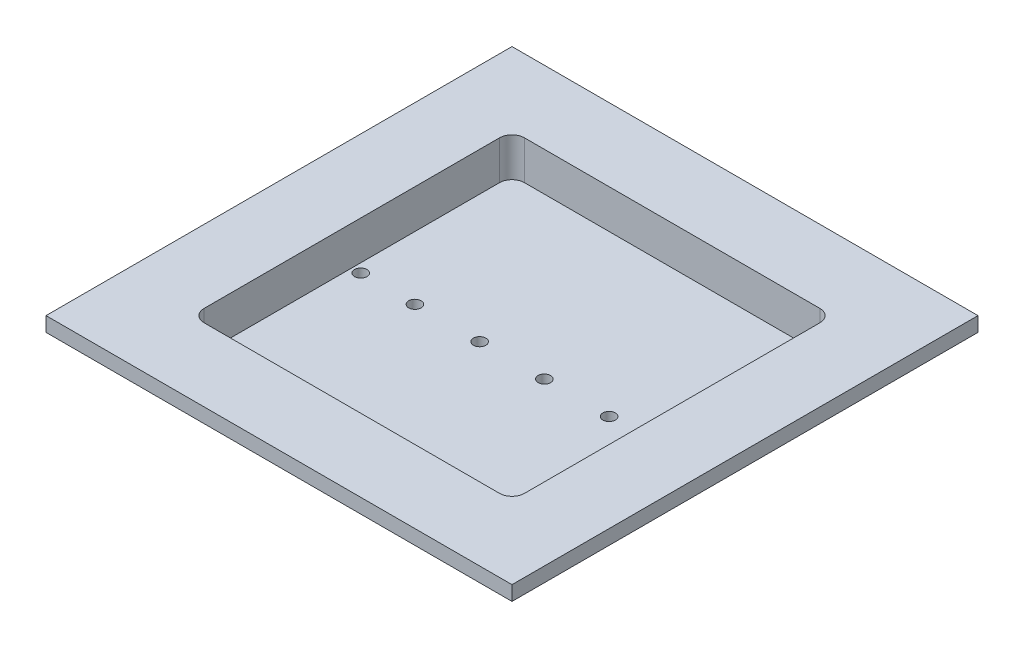
ISO-10303-21;
HEADER;
FILE_DESCRIPTION(('STEP AP214'),'2;1');
FILE_NAME('part.step','',(''),(''),'','','');
FILE_SCHEMA(('AUTOMOTIVE_DESIGN { 1 0 10303 214 1 1 1 1 }'));
ENDSEC;
DATA;
#1=APPLICATION_CONTEXT('core data for automotive mechanical design processes');
#2=APPLICATION_PROTOCOL_DEFINITION('international standard','automotive_design',2000,#1);
#3=PRODUCT_CONTEXT('',#1,'mechanical');
#4=PRODUCT('Part','Part','',(#3));
#5=PRODUCT_RELATED_PRODUCT_CATEGORY('part','',(#4));
#6=PRODUCT_DEFINITION_FORMATION('','',#4);
#7=PRODUCT_DEFINITION_CONTEXT('part definition',#1,'design');
#8=PRODUCT_DEFINITION('design','',#6,#7);
#9=PRODUCT_DEFINITION_SHAPE('','',#8);
#10=(LENGTH_UNIT() NAMED_UNIT(*) SI_UNIT(.MILLI.,.METRE.));
#11=(NAMED_UNIT(*) PLANE_ANGLE_UNIT() SI_UNIT($,.RADIAN.));
#12=(NAMED_UNIT(*) SI_UNIT($,.STERADIAN.) SOLID_ANGLE_UNIT());
#13=UNCERTAINTY_MEASURE_WITH_UNIT(LENGTH_MEASURE(1.E-05),#10,'distance_accuracy_value','');
#14=(GEOMETRIC_REPRESENTATION_CONTEXT(3) GLOBAL_UNCERTAINTY_ASSIGNED_CONTEXT((#13)) GLOBAL_UNIT_ASSIGNED_CONTEXT((#10,
#11,#12)) REPRESENTATION_CONTEXT('',''));
#15=CARTESIAN_POINT('',(0.,0.,0.));
#16=DIRECTION('',(0.,0.,1.));
#17=DIRECTION('',(1.,0.,0.));
#18=AXIS2_PLACEMENT_3D('',#15,#16,#17);
#19=CARTESIAN_POINT('',(0.,-7.5,0.));
#20=DIRECTION('',(0.,-1.,0.));
#21=DIRECTION('',(0.,0.,-1.));
#22=AXIS2_PLACEMENT_3D('',#19,#20,#21);
#23=PLANE('',#22);
#24=CARTESIAN_POINT('',(61.6825,-7.5,-37.4074999999998));
#25=DIRECTION('',(0.,-1.,0.));
#26=DIRECTION('',(0.,0.,-1.));
#27=AXIS2_PLACEMENT_3D('',#24,#25,#26);
#28=CIRCLE('',#27,0.999999999999992);
#29=CARTESIAN_POINT('',(61.6825,-7.5,-38.4074999999998));
#30=VERTEX_POINT('',#29);
#31=EDGE_CURVE('E487',#30,#30,#28,.F.);
#32=ORIENTED_EDGE('',*,*,#31,.T.);
#33=EDGE_LOOP('',(#32));
#34=FACE_BOUND('',#33,.T.);
#35=DIRECTION('',(0.,0.,1.));
#36=VECTOR('',#35,1.);
#37=CARTESIAN_POINT('',(65.2,-7.5,0.));
#38=LINE('',#37,#36);
#39=CARTESIAN_POINT('',(65.2,-7.5,-65.2));
#40=VERTEX_POINT('',#39);
#41=CARTESIAN_POINT('',(65.2,-7.5,-9.59999999999999));
#42=VERTEX_POINT('',#41);
#43=EDGE_CURVE('E353',#40,#42,#38,.T.);
#44=ORIENTED_EDGE('',*,*,#43,.T.);
#45=DIRECTION('',(-1.,0.,0.));
#46=VECTOR('',#45,1.);
#47=CARTESIAN_POINT('',(0.,-7.5,-9.59999999999998));
#48=LINE('',#47,#46);
#49=CARTESIAN_POINT('',(9.59999999999998,-7.5,-9.59999999999998));
#50=VERTEX_POINT('',#49);
#51=EDGE_CURVE('E356',#42,#50,#48,.T.);
#52=ORIENTED_EDGE('',*,*,#51,.T.);
#53=DIRECTION('',(0.,0.,-1.));
#54=VECTOR('',#53,1.);
#55=CARTESIAN_POINT('',(9.59999999999999,-7.5,0.));
#56=LINE('',#55,#54);
#57=CARTESIAN_POINT('',(9.59999999999998,-7.5,-65.2));
#58=VERTEX_POINT('',#57);
#59=EDGE_CURVE('E347',#50,#58,#56,.T.);
#60=ORIENTED_EDGE('',*,*,#59,.T.);
#61=DIRECTION('',(1.,0.,0.));
#62=VECTOR('',#61,1.);
#63=CARTESIAN_POINT('',(0.,-7.5,-65.2));
#64=LINE('',#63,#62);
#65=EDGE_CURVE('E350',#58,#40,#64,.T.);
#66=ORIENTED_EDGE('',*,*,#65,.T.);
#67=EDGE_LOOP('',(#44,#52,#60,#66));
#68=FACE_BOUND('',#67,.T.);
#69=CARTESIAN_POINT('',(52.9824999883334,-7.5,-37.4025));
#70=DIRECTION('',(0.,-1.,0.));
#71=DIRECTION('',(0.,0.,-1.));
#72=AXIS2_PLACEMENT_3D('',#69,#70,#71);
#73=CIRCLE('',#72,0.999999999999998);
#74=CARTESIAN_POINT('',(52.9824999883334,-7.5,-38.4025));
#75=VERTEX_POINT('',#74);
#76=EDGE_CURVE('E461',#75,#75,#73,.T.);
#77=ORIENTED_EDGE('',*,*,#76,.F.);
#78=EDGE_LOOP('',(#77));
#79=FACE_BOUND('',#78,.T.);
#80=CARTESIAN_POINT('',(42.5886111061111,-7.5,-37.4075));
#81=DIRECTION('',(0.,-1.,0.));
#82=DIRECTION('',(0.,0.,-1.));
#83=AXIS2_PLACEMENT_3D('',#80,#81,#82);
#84=CIRCLE('',#83,0.999999999999998);
#85=CARTESIAN_POINT('',(42.5886111061111,-7.5,-38.4075));
#86=VERTEX_POINT('',#85);
#87=EDGE_CURVE('E465',#86,#86,#84,.T.);
#88=ORIENTED_EDGE('',*,*,#87,.F.);
#89=EDGE_LOOP('',(#88));
#90=FACE_BOUND('',#89,.T.);
#91=CARTESIAN_POINT('',(32.1986111061111,-7.5,-37.4074999999999));
#92=DIRECTION('',(0.,-1.,0.));
#93=DIRECTION('',(0.,0.,-1.));
#94=AXIS2_PLACEMENT_3D('',#91,#92,#93);
#95=CIRCLE('',#94,0.999999999999998);
#96=CARTESIAN_POINT('',(32.1986111061111,-7.5,-38.4074999999999));
#97=VERTEX_POINT('',#96);
#98=EDGE_CURVE('E469',#97,#97,#95,.T.);
#99=ORIENTED_EDGE('',*,*,#98,.F.);
#100=EDGE_LOOP('',(#99));
#101=FACE_BOUND('',#100,.T.);
#102=CARTESIAN_POINT('',(21.8086111061111,-7.5,-37.4074999999999));
#103=DIRECTION('',(0.,-1.,0.));
#104=DIRECTION('',(0.,0.,-1.));
#105=AXIS2_PLACEMENT_3D('',#102,#103,#104);
#106=CIRCLE('',#105,0.999999999999998);
#107=CARTESIAN_POINT('',(21.8086111061111,-7.5,-38.4074999999999));
#108=VERTEX_POINT('',#107);
#109=EDGE_CURVE('E473',#108,#108,#106,.T.);
#110=ORIENTED_EDGE('',*,*,#109,.F.);
#111=EDGE_LOOP('',(#110));
#112=FACE_BOUND('',#111,.T.);
#113=CARTESIAN_POINT('',(13.1125,-7.5,-37.4074999999998));
#114=DIRECTION('',(0.,-1.,0.));
#115=DIRECTION('',(0.,0.,-1.));
#116=AXIS2_PLACEMENT_3D('',#113,#114,#115);
#117=CIRCLE('',#116,1.);
#118=CARTESIAN_POINT('',(13.1125,-7.5,-38.4074999999998));
#119=VERTEX_POINT('',#118);
#120=EDGE_CURVE('E215',#119,#119,#117,.T.);
#121=ORIENTED_EDGE('',*,*,#120,.F.);
#122=EDGE_LOOP('',(#121));
#123=FACE_BOUND('',#122,.T.);
#124=ADVANCED_FACE('F40',(#34,#68,#79,#90,#101,#112,#123),#23,.T.);
#125=CARTESIAN_POINT('',(61.1125,-3.89583333333333,-13.6875));
#126=DIRECTION('',(0.,-1.,0.));
#127=DIRECTION('',(0.,0.,-1.));
#128=AXIS2_PLACEMENT_3D('',#125,#126,#127);
#129=PLANE('',#128);
#130=CARTESIAN_POINT('',(21.8086111061111,-3.89583333333333,-37.4074999999999));
#131=DIRECTION('',(0.,1.,0.));
#132=DIRECTION('',(0.,0.,1.));
#133=AXIS2_PLACEMENT_3D('',#130,#131,#132);
#134=CIRCLE('',#133,0.999999999999998);
#135=CARTESIAN_POINT('',(21.8086111061111,-3.89583333333333,-36.4074999999999));
#136=VERTEX_POINT('',#135);
#137=EDGE_CURVE('E508',#136,#136,#134,.T.);
#138=ORIENTED_EDGE('',*,*,#137,.F.);
#139=EDGE_LOOP('',(#138));
#140=FACE_BOUND('',#139,.T.);
#141=CARTESIAN_POINT('',(42.5886111061111,-3.89583333333333,-37.4075));
#142=DIRECTION('',(0.,1.,0.));
#143=DIRECTION('',(0.,0.,1.));
#144=AXIS2_PLACEMENT_3D('',#141,#142,#143);
#145=CIRCLE('',#144,0.999999999999998);
#146=CARTESIAN_POINT('',(42.5886111061111,-3.89583333333333,-36.4075));
#147=VERTEX_POINT('',#146);
#148=EDGE_CURVE('E500',#147,#147,#145,.T.);
#149=ORIENTED_EDGE('',*,*,#148,.F.);
#150=EDGE_LOOP('',(#149));
#151=FACE_BOUND('',#150,.T.);
#152=CARTESIAN_POINT('',(61.1125,-3.89583333333333,-13.6875));
#153=DIRECTION('',(0.,1.,0.));
#154=DIRECTION('',(0.,0.,-1.));
#155=AXIS2_PLACEMENT_3D('',#152,#153,#154);
#156=CIRCLE('',#155,2.);
#157=CARTESIAN_POINT('',(61.1125,-3.89583333333333,-11.6875));
#158=VERTEX_POINT('',#157);
#159=CARTESIAN_POINT('',(63.1125,-3.89583333333333,-13.6875));
#160=VERTEX_POINT('',#159);
#161=EDGE_CURVE('E185',#158,#160,#156,.T.);
#162=ORIENTED_EDGE('',*,*,#161,.T.);
#163=DIRECTION('',(0.,0.,-1.));
#164=VECTOR('',#163,1.);
#165=CARTESIAN_POINT('',(63.1125,-3.89583333333333,-61.1125));
#166=LINE('',#165,#164);
#167=CARTESIAN_POINT('',(63.1125,-3.89583333333333,-61.1125));
#168=VERTEX_POINT('',#167);
#169=EDGE_CURVE('E195',#160,#168,#166,.T.);
#170=ORIENTED_EDGE('',*,*,#169,.T.);
#171=CARTESIAN_POINT('',(61.1125,-3.89583333333333,-61.1125));
#172=DIRECTION('',(0.,1.,0.));
#173=DIRECTION('',(0.,0.,1.));
#174=AXIS2_PLACEMENT_3D('',#171,#172,#173);
#175=CIRCLE('',#174,2.);
#176=CARTESIAN_POINT('',(61.1125,-3.89583333333333,-63.1125));
#177=VERTEX_POINT('',#176);
#178=EDGE_CURVE('E201',#168,#177,#175,.T.);
#179=ORIENTED_EDGE('',*,*,#178,.T.);
#180=DIRECTION('',(-1.,0.,0.));
#181=VECTOR('',#180,1.);
#182=CARTESIAN_POINT('',(61.1125,-3.89583333333333,-63.1125));
#183=LINE('',#182,#181);
#184=CARTESIAN_POINT('',(13.6875,-3.89583333333333,-63.1125));
#185=VERTEX_POINT('',#184);
#186=EDGE_CURVE('E220',#177,#185,#183,.T.);
#187=ORIENTED_EDGE('',*,*,#186,.T.);
#188=CARTESIAN_POINT('',(13.6875,-3.89583333333333,-61.1125));
#189=DIRECTION('',(0.,1.,0.));
#190=DIRECTION('',(0.,0.,-1.));
#191=AXIS2_PLACEMENT_3D('',#188,#189,#190);
#192=CIRCLE('',#191,2.);
#193=CARTESIAN_POINT('',(11.6875,-3.89583333333333,-61.1125));
#194=VERTEX_POINT('',#193);
#195=EDGE_CURVE('E224',#185,#194,#192,.T.);
#196=ORIENTED_EDGE('',*,*,#195,.T.);
#197=DIRECTION('',(0.,0.,1.));
#198=VECTOR('',#197,1.);
#199=CARTESIAN_POINT('',(11.6875,-3.89583333333333,-61.1125));
#200=LINE('',#199,#198);
#201=CARTESIAN_POINT('',(11.6875,-3.89583333333333,-13.6875));
#202=VERTEX_POINT('',#201);
#203=EDGE_CURVE('E228',#194,#202,#200,.T.);
#204=ORIENTED_EDGE('',*,*,#203,.T.);
#205=CARTESIAN_POINT('',(13.6875,-3.89583333333333,-13.6875));
#206=DIRECTION('',(0.,1.,0.));
#207=DIRECTION('',(0.,0.,1.));
#208=AXIS2_PLACEMENT_3D('',#205,#206,#207);
#209=CIRCLE('',#208,2.);
#210=CARTESIAN_POINT('',(13.6875,-3.89583333333333,-11.6875));
#211=VERTEX_POINT('',#210);
#212=EDGE_CURVE('E232',#202,#211,#209,.T.);
#213=ORIENTED_EDGE('',*,*,#212,.T.);
#214=DIRECTION('',(1.,0.,0.));
#215=VECTOR('',#214,1.);
#216=CARTESIAN_POINT('',(61.1125,-3.89583333333333,-11.6875));
#217=LINE('',#216,#215);
#218=EDGE_CURVE('E192',#211,#158,#217,.T.);
#219=ORIENTED_EDGE('',*,*,#218,.T.);
#220=EDGE_LOOP('',(#162,#170,#179,#187,#196,#204,#213,#219));
#221=FACE_BOUND('',#220,.T.);
#222=CARTESIAN_POINT('',(61.6825,-3.89583333333333,-37.4074999999998));
#223=DIRECTION('',(0.,1.,0.));
#224=DIRECTION('',(0.,0.,1.));
#225=AXIS2_PLACEMENT_3D('',#222,#223,#224);
#226=CIRCLE('',#225,0.999999999999992);
#227=CARTESIAN_POINT('',(61.6825,-3.89583333333333,-36.4074999999999));
#228=VERTEX_POINT('',#227);
#229=EDGE_CURVE('E492',#228,#228,#226,.F.);
#230=ORIENTED_EDGE('',*,*,#229,.T.);
#231=EDGE_LOOP('',(#230));
#232=FACE_BOUND('',#231,.T.);
#233=CARTESIAN_POINT('',(52.9824999883334,-3.89583333333333,-37.4025));
#234=DIRECTION('',(0.,1.,0.));
#235=DIRECTION('',(0.,0.,1.));
#236=AXIS2_PLACEMENT_3D('',#233,#234,#235);
#237=CIRCLE('',#236,0.999999999999998);
#238=CARTESIAN_POINT('',(52.9824999883334,-3.89583333333333,-36.4025));
#239=VERTEX_POINT('',#238);
#240=EDGE_CURVE('E496',#239,#239,#237,.T.);
#241=ORIENTED_EDGE('',*,*,#240,.F.);
#242=EDGE_LOOP('',(#241));
#243=FACE_BOUND('',#242,.T.);
#244=CARTESIAN_POINT('',(32.1986111061111,-3.89583333333333,-37.4074999999999));
#245=DIRECTION('',(0.,1.,0.));
#246=DIRECTION('',(0.,0.,1.));
#247=AXIS2_PLACEMENT_3D('',#244,#245,#246);
#248=CIRCLE('',#247,0.999999999999998);
#249=CARTESIAN_POINT('',(32.1986111061111,-3.89583333333333,-36.4074999999999));
#250=VERTEX_POINT('',#249);
#251=EDGE_CURVE('E504',#250,#250,#248,.T.);
#252=ORIENTED_EDGE('',*,*,#251,.F.);
#253=EDGE_LOOP('',(#252));
#254=FACE_BOUND('',#253,.T.);
#255=CARTESIAN_POINT('',(13.1125,-3.89583333333333,-37.4074999999998));
#256=DIRECTION('',(0.,1.,0.));
#257=DIRECTION('',(0.,0.,1.));
#258=AXIS2_PLACEMENT_3D('',#255,#256,#257);
#259=CIRCLE('',#258,1.);
#260=CARTESIAN_POINT('',(13.1125,-3.89583333333333,-36.4074999999998));
#261=VERTEX_POINT('',#260);
#262=EDGE_CURVE('E491',#261,#261,#259,.T.);
#263=ORIENTED_EDGE('',*,*,#262,.F.);
#264=EDGE_LOOP('',(#263));
#265=FACE_BOUND('',#264,.T.);
#266=ADVANCED_FACE('F203',(#140,#151,#221,#232,#243,#254,#265),#129,.F.);
#267=CARTESIAN_POINT('',(0.,0.,0.));
#268=DIRECTION('',(0.,-1.,0.));
#269=DIRECTION('',(0.,0.,-1.));
#270=AXIS2_PLACEMENT_3D('',#267,#268,#269);
#271=PLANE('',#270);
#272=DIRECTION('',(0.,0.,-1.));
#273=VECTOR('',#272,1.);
#274=CARTESIAN_POINT('',(65.7,0.,-65.45));
#275=LINE('',#274,#273);
#276=CARTESIAN_POINT('',(65.7,0.,-9.1));
#277=VERTEX_POINT('',#276);
#278=CARTESIAN_POINT('',(65.7,0.,-65.7));
#279=VERTEX_POINT('',#278);
#280=EDGE_CURVE('E382',#277,#279,#275,.T.);
#281=ORIENTED_EDGE('',*,*,#280,.T.);
#282=DIRECTION('',(-1.,0.,0.));
#283=VECTOR('',#282,1.);
#284=CARTESIAN_POINT('',(9.34999999999999,0.,-65.7));
#285=LINE('',#284,#283);
#286=CARTESIAN_POINT('',(9.09999999999999,0.,-65.7));
#287=VERTEX_POINT('',#286);
#288=EDGE_CURVE('E11',#279,#287,#285,.T.);
#289=ORIENTED_EDGE('',*,*,#288,.T.);
#290=DIRECTION('',(0.,0.,1.));
#291=VECTOR('',#290,1.);
#292=CARTESIAN_POINT('',(9.1,0.,-9.35));
#293=LINE('',#292,#291);
#294=CARTESIAN_POINT('',(9.1,0.,-9.1));
#295=VERTEX_POINT('',#294);
#296=EDGE_CURVE('E51',#287,#295,#293,.T.);
#297=ORIENTED_EDGE('',*,*,#296,.T.);
#298=DIRECTION('',(1.,0.,0.));
#299=VECTOR('',#298,1.);
#300=CARTESIAN_POINT('',(65.45,0.,-9.1));
#301=LINE('',#300,#299);
#302=EDGE_CURVE('E379',#295,#277,#301,.T.);
#303=ORIENTED_EDGE('',*,*,#302,.T.);
#304=EDGE_LOOP('',(#281,#289,#297,#303));
#305=FACE_BOUND('',#304,.T.);
#306=DIRECTION('',(0.,0.,1.));
#307=VECTOR('',#306,1.);
#308=CARTESIAN_POINT('',(0.,0.,-74.8));
#309=LINE('',#308,#307);
#310=CARTESIAN_POINT('',(0.,0.,-74.8));
#311=VERTEX_POINT('',#310);
#312=CARTESIAN_POINT('',(0.,0.,0.));
#313=VERTEX_POINT('',#312);
#314=EDGE_CURVE('E285',#311,#313,#309,.T.);
#315=ORIENTED_EDGE('',*,*,#314,.F.);
#316=DIRECTION('',(-1.,0.,0.));
#317=VECTOR('',#316,1.);
#318=CARTESIAN_POINT('',(74.8,0.,-74.8));
#319=LINE('',#318,#317);
#320=CARTESIAN_POINT('',(74.8,0.,-74.8));
#321=VERTEX_POINT('',#320);
#322=EDGE_CURVE('E304',#321,#311,#319,.T.);
#323=ORIENTED_EDGE('',*,*,#322,.F.);
#324=DIRECTION('',(0.,0.,-1.));
#325=VECTOR('',#324,1.);
#326=CARTESIAN_POINT('',(74.8,0.,-74.8));
#327=LINE('',#326,#325);
#328=CARTESIAN_POINT('',(74.8,0.,0.));
#329=VERTEX_POINT('',#328);
#330=EDGE_CURVE('E320',#329,#321,#327,.T.);
#331=ORIENTED_EDGE('',*,*,#330,.F.);
#332=DIRECTION('',(1.,0.,0.));
#333=VECTOR('',#332,1.);
#334=CARTESIAN_POINT('',(74.8,0.,0.));
#335=LINE('',#334,#333);
#336=EDGE_CURVE('E317',#313,#329,#335,.T.);
#337=ORIENTED_EDGE('',*,*,#336,.F.);
#338=EDGE_LOOP('',(#315,#323,#331,#337));
#339=FACE_BOUND('',#338,.T.);
#340=ADVANCED_FACE('F519',(#305,#339),#271,.T.);
#341=CARTESIAN_POINT('',(0.,2.3375,-74.8));
#342=DIRECTION('',(1.,0.,0.));
#343=DIRECTION('',(0.,0.,-1.));
#344=AXIS2_PLACEMENT_3D('',#341,#342,#343);
#345=PLANE('',#344);
#346=ORIENTED_EDGE('',*,*,#314,.T.);
#347=DIRECTION('',(0.,-1.,0.));
#348=VECTOR('',#347,1.);
#349=CARTESIAN_POINT('',(0.,2.3375,0.));
#350=LINE('',#349,#348);
#351=CARTESIAN_POINT('',(0.,2.3375,0.));
#352=VERTEX_POINT('',#351);
#353=EDGE_CURVE('E336',#352,#313,#350,.T.);
#354=ORIENTED_EDGE('',*,*,#353,.F.);
#355=DIRECTION('',(0.,0.,1.));
#356=VECTOR('',#355,1.);
#357=CARTESIAN_POINT('',(0.,2.3375,-74.8));
#358=LINE('',#357,#356);
#359=CARTESIAN_POINT('',(0.,2.3375,-74.8));
#360=VERTEX_POINT('',#359);
#361=EDGE_CURVE('E299',#360,#352,#358,.T.);
#362=ORIENTED_EDGE('',*,*,#361,.F.);
#363=DIRECTION('',(0.,-1.,0.));
#364=VECTOR('',#363,1.);
#365=CARTESIAN_POINT('',(0.,2.3375,-74.8));
#366=LINE('',#365,#364);
#367=EDGE_CURVE('E313',#360,#311,#366,.T.);
#368=ORIENTED_EDGE('',*,*,#367,.T.);
#369=EDGE_LOOP('',(#346,#354,#362,#368));
#370=FACE_BOUND('',#369,.T.);
#371=ADVANCED_FACE('F526',(#370),#345,.F.);
#372=CARTESIAN_POINT('',(74.8,2.3375,0.));
#373=DIRECTION('',(0.,0.,-1.));
#374=DIRECTION('',(-1.,0.,0.));
#375=AXIS2_PLACEMENT_3D('',#372,#373,#374);
#376=PLANE('',#375);
#377=ORIENTED_EDGE('',*,*,#336,.T.);
#378=DIRECTION('',(0.,-1.,0.));
#379=VECTOR('',#378,1.);
#380=CARTESIAN_POINT('',(74.8,2.3375,0.));
#381=LINE('',#380,#379);
#382=CARTESIAN_POINT('',(74.8,2.3375,0.));
#383=VERTEX_POINT('',#382);
#384=EDGE_CURVE('E332',#383,#329,#381,.T.);
#385=ORIENTED_EDGE('',*,*,#384,.F.);
#386=DIRECTION('',(1.,0.,0.));
#387=VECTOR('',#386,1.);
#388=CARTESIAN_POINT('',(74.8,2.3375,0.));
#389=LINE('',#388,#387);
#390=EDGE_CURVE('E303',#352,#383,#389,.T.);
#391=ORIENTED_EDGE('',*,*,#390,.F.);
#392=ORIENTED_EDGE('',*,*,#353,.T.);
#393=EDGE_LOOP('',(#377,#385,#391,#392));
#394=FACE_BOUND('',#393,.T.);
#395=ADVANCED_FACE('F583',(#394),#376,.F.);
#396=CARTESIAN_POINT('',(74.8,2.3375,-74.8));
#397=DIRECTION('',(-1.,0.,0.));
#398=DIRECTION('',(0.,0.,1.));
#399=AXIS2_PLACEMENT_3D('',#396,#397,#398);
#400=PLANE('',#399);
#401=ORIENTED_EDGE('',*,*,#330,.T.);
#402=DIRECTION('',(0.,-1.,0.));
#403=VECTOR('',#402,1.);
#404=CARTESIAN_POINT('',(74.8,2.3375,-74.8));
#405=LINE('',#404,#403);
#406=CARTESIAN_POINT('',(74.8,2.3375,-74.8));
#407=VERTEX_POINT('',#406);
#408=EDGE_CURVE('E328',#407,#321,#405,.T.);
#409=ORIENTED_EDGE('',*,*,#408,.F.);
#410=DIRECTION('',(0.,0.,-1.));
#411=VECTOR('',#410,1.);
#412=CARTESIAN_POINT('',(74.8,2.3375,-74.8));
#413=LINE('',#412,#411);
#414=EDGE_CURVE('E307',#383,#407,#413,.T.);
#415=ORIENTED_EDGE('',*,*,#414,.F.);
#416=ORIENTED_EDGE('',*,*,#384,.T.);
#417=EDGE_LOOP('',(#401,#409,#415,#416));
#418=FACE_BOUND('',#417,.T.);
#419=ADVANCED_FACE('F579',(#418),#400,.F.);
#420=CARTESIAN_POINT('',(74.8,2.3375,-74.8));
#421=DIRECTION('',(0.,0.,1.));
#422=DIRECTION('',(1.,0.,0.));
#423=AXIS2_PLACEMENT_3D('',#420,#421,#422);
#424=PLANE('',#423);
#425=ORIENTED_EDGE('',*,*,#322,.T.);
#426=ORIENTED_EDGE('',*,*,#367,.F.);
#427=DIRECTION('',(-1.,0.,0.));
#428=VECTOR('',#427,1.);
#429=CARTESIAN_POINT('',(74.8,2.3375,-74.8));
#430=LINE('',#429,#428);
#431=EDGE_CURVE('E310',#407,#360,#430,.T.);
#432=ORIENTED_EDGE('',*,*,#431,.F.);
#433=ORIENTED_EDGE('',*,*,#408,.T.);
#434=EDGE_LOOP('',(#425,#426,#432,#433));
#435=FACE_BOUND('',#434,.T.);
#436=ADVANCED_FACE('F574',(#435),#424,.F.);
#437=CARTESIAN_POINT('',(0.,2.3375,0.));
#438=DIRECTION('',(0.,-1.,0.));
#439=DIRECTION('',(0.,0.,-1.));
#440=AXIS2_PLACEMENT_3D('',#437,#438,#439);
#441=PLANE('',#440);
#442=DIRECTION('',(0.,0.,-1.));
#443=VECTOR('',#442,1.);
#444=CARTESIAN_POINT('',(63.1125,2.3375,-61.1125));
#445=LINE('',#444,#443);
#446=CARTESIAN_POINT('',(63.1125,2.3375,-13.6875));
#447=VERTEX_POINT('',#446);
#448=CARTESIAN_POINT('',(63.1125,2.3375,-61.1125));
#449=VERTEX_POINT('',#448);
#450=EDGE_CURVE('E239',#447,#449,#445,.T.);
#451=ORIENTED_EDGE('',*,*,#450,.F.);
#452=CARTESIAN_POINT('',(61.1125,2.3375,-13.6875));
#453=DIRECTION('',(0.,1.,0.));
#454=DIRECTION('',(0.,0.,-1.));
#455=AXIS2_PLACEMENT_3D('',#452,#453,#454);
#456=CIRCLE('',#455,2.);
#457=CARTESIAN_POINT('',(61.1125,2.3375,-11.6875));
#458=VERTEX_POINT('',#457);
#459=EDGE_CURVE('E59',#458,#447,#456,.T.);
#460=ORIENTED_EDGE('',*,*,#459,.F.);
#461=DIRECTION('',(1.,0.,0.));
#462=VECTOR('',#461,1.);
#463=CARTESIAN_POINT('',(61.1125,2.3375,-11.6875));
#464=LINE('',#463,#462);
#465=CARTESIAN_POINT('',(13.6875,2.3375,-11.6875));
#466=VERTEX_POINT('',#465);
#467=EDGE_CURVE('E208',#466,#458,#464,.T.);
#468=ORIENTED_EDGE('',*,*,#467,.F.);
#469=CARTESIAN_POINT('',(13.6875,2.3375,-13.6875));
#470=DIRECTION('',(0.,1.,0.));
#471=DIRECTION('',(0.,0.,1.));
#472=AXIS2_PLACEMENT_3D('',#469,#470,#471);
#473=CIRCLE('',#472,2.);
#474=CARTESIAN_POINT('',(11.6875,2.3375,-13.6875));
#475=VERTEX_POINT('',#474);
#476=EDGE_CURVE('E212',#475,#466,#473,.T.);
#477=ORIENTED_EDGE('',*,*,#476,.F.);
#478=DIRECTION('',(0.,0.,1.));
#479=VECTOR('',#478,1.);
#480=CARTESIAN_POINT('',(11.6875,2.3375,-61.1125));
#481=LINE('',#480,#479);
#482=CARTESIAN_POINT('',(11.6875,2.3375,-61.1125));
#483=VERTEX_POINT('',#482);
#484=EDGE_CURVE('E254',#483,#475,#481,.T.);
#485=ORIENTED_EDGE('',*,*,#484,.F.);
#486=CARTESIAN_POINT('',(13.6875,2.3375,-61.1125));
#487=DIRECTION('',(0.,1.,0.));
#488=DIRECTION('',(0.,0.,-1.));
#489=AXIS2_PLACEMENT_3D('',#486,#487,#488);
#490=CIRCLE('',#489,2.);
#491=CARTESIAN_POINT('',(13.6875,2.3375,-63.1125));
#492=VERTEX_POINT('',#491);
#493=EDGE_CURVE('E250',#492,#483,#490,.T.);
#494=ORIENTED_EDGE('',*,*,#493,.F.);
#495=DIRECTION('',(-1.,0.,0.));
#496=VECTOR('',#495,1.);
#497=CARTESIAN_POINT('',(61.1125,2.3375,-63.1125));
#498=LINE('',#497,#496);
#499=CARTESIAN_POINT('',(61.1125,2.3375,-63.1125));
#500=VERTEX_POINT('',#499);
#501=EDGE_CURVE('E246',#500,#492,#498,.T.);
#502=ORIENTED_EDGE('',*,*,#501,.F.);
#503=CARTESIAN_POINT('',(61.1125,2.3375,-61.1125));
#504=DIRECTION('',(0.,1.,0.));
#505=DIRECTION('',(0.,0.,1.));
#506=AXIS2_PLACEMENT_3D('',#503,#504,#505);
#507=CIRCLE('',#506,2.);
#508=EDGE_CURVE('E242',#449,#500,#507,.T.);
#509=ORIENTED_EDGE('',*,*,#508,.F.);
#510=EDGE_LOOP('',(#451,#460,#468,#477,#485,#494,#502,#509));
#511=FACE_BOUND('',#510,.T.);
#512=ORIENTED_EDGE('',*,*,#361,.T.);
#513=ORIENTED_EDGE('',*,*,#390,.T.);
#514=ORIENTED_EDGE('',*,*,#414,.T.);
#515=ORIENTED_EDGE('',*,*,#431,.T.);
#516=EDGE_LOOP('',(#512,#513,#514,#515));
#517=FACE_BOUND('',#516,.T.);
#518=ADVANCED_FACE('F572',(#511,#517),#441,.F.);
#519=CARTESIAN_POINT('',(9.34999999999999,-7.5,-65.45));
#520=DIRECTION('',(-1.,0.,0.));
#521=DIRECTION('',(0.,0.,1.));
#522=AXIS2_PLACEMENT_3D('',#519,#520,#521);
#523=PLANE('',#522);
#524=DIRECTION('',(0.,1.,0.));
#525=VECTOR('',#524,1.);
#526=CARTESIAN_POINT('',(9.34999999999999,-7.5,-65.45));
#527=LINE('',#526,#525);
#528=CARTESIAN_POINT('',(9.34999999999999,-7.25000000000001,-65.45));
#529=VERTEX_POINT('',#528);
#530=CARTESIAN_POINT('',(9.34999999999999,-0.249999999999986,-65.45));
#531=VERTEX_POINT('',#530);
#532=EDGE_CURVE('E281',#529,#531,#527,.T.);
#533=ORIENTED_EDGE('',*,*,#532,.F.);
#534=DIRECTION('',(0.,0.,1.));
#535=VECTOR('',#534,1.);
#536=CARTESIAN_POINT('',(9.34999999999999,-7.25000000000001,-65.45));
#537=LINE('',#536,#535);
#538=CARTESIAN_POINT('',(9.35,-7.25000000000001,-9.35));
#539=VERTEX_POINT('',#538);
#540=EDGE_CURVE('E376',#529,#539,#537,.T.);
#541=ORIENTED_EDGE('',*,*,#540,.T.);
#542=DIRECTION('',(0.,1.,0.));
#543=VECTOR('',#542,1.);
#544=CARTESIAN_POINT('',(9.35,-7.5,-9.35));
#545=LINE('',#544,#543);
#546=CARTESIAN_POINT('',(9.35,-0.249999999999986,-9.35));
#547=VERTEX_POINT('',#546);
#548=EDGE_CURVE('E294',#539,#547,#545,.T.);
#549=ORIENTED_EDGE('',*,*,#548,.T.);
#550=DIRECTION('',(0.,0.,-1.));
#551=VECTOR('',#550,1.);
#552=CARTESIAN_POINT('',(9.34999999999999,-0.249999999999986,-65.45));
#553=LINE('',#552,#551);
#554=EDGE_CURVE('E373',#547,#531,#553,.T.);
#555=ORIENTED_EDGE('',*,*,#554,.T.);
#556=EDGE_LOOP('',(#533,#541,#549,#555));
#557=FACE_BOUND('',#556,.T.);
#558=ADVANCED_FACE('F428',(#557),#523,.T.);
#559=CARTESIAN_POINT('',(65.45,-7.5,-65.45));
#560=DIRECTION('',(0.,0.,-1.));
#561=DIRECTION('',(-1.,0.,0.));
#562=AXIS2_PLACEMENT_3D('',#559,#560,#561);
#563=PLANE('',#562);
#564=DIRECTION('',(0.,1.,0.));
#565=VECTOR('',#564,1.);
#566=CARTESIAN_POINT('',(65.45,-7.5,-65.45));
#567=LINE('',#566,#565);
#568=CARTESIAN_POINT('',(65.45,-7.25000000000001,-65.45));
#569=VERTEX_POINT('',#568);
#570=CARTESIAN_POINT('',(65.45,-0.249999999999986,-65.45));
#571=VERTEX_POINT('',#570);
#572=EDGE_CURVE('E286',#569,#571,#567,.T.);
#573=ORIENTED_EDGE('',*,*,#572,.F.);
#574=DIRECTION('',(-1.,0.,0.));
#575=VECTOR('',#574,1.);
#576=CARTESIAN_POINT('',(65.45,-7.25000000000001,-65.45));
#577=LINE('',#576,#575);
#578=EDGE_CURVE('E370',#569,#529,#577,.T.);
#579=ORIENTED_EDGE('',*,*,#578,.T.);
#580=ORIENTED_EDGE('',*,*,#532,.T.);
#581=DIRECTION('',(1.,0.,0.));
#582=VECTOR('',#581,1.);
#583=CARTESIAN_POINT('',(65.45,-0.249999999999986,-65.45));
#584=LINE('',#583,#582);
#585=EDGE_CURVE('E366',#531,#571,#584,.T.);
#586=ORIENTED_EDGE('',*,*,#585,.T.);
#587=EDGE_LOOP('',(#573,#579,#580,#586));
#588=FACE_BOUND('',#587,.T.);
#589=ADVANCED_FACE('F445',(#588),#563,.T.);
#590=CARTESIAN_POINT('',(65.45,-7.5,-65.45));
#591=DIRECTION('',(1.,0.,0.));
#592=DIRECTION('',(0.,0.,-1.));
#593=AXIS2_PLACEMENT_3D('',#590,#591,#592);
#594=PLANE('',#593);
#595=DIRECTION('',(0.,1.,0.));
#596=VECTOR('',#595,1.);
#597=CARTESIAN_POINT('',(65.45,-7.5,-9.35));
#598=LINE('',#597,#596);
#599=CARTESIAN_POINT('',(65.45,-7.25000000000001,-9.35));
#600=VERTEX_POINT('',#599);
#601=CARTESIAN_POINT('',(65.45,-0.249999999999986,-9.35));
#602=VERTEX_POINT('',#601);
#603=EDGE_CURVE('E290',#600,#602,#598,.T.);
#604=ORIENTED_EDGE('',*,*,#603,.F.);
#605=DIRECTION('',(0.,0.,-1.));
#606=VECTOR('',#605,1.);
#607=CARTESIAN_POINT('',(65.45,-7.25000000000001,-65.45));
#608=LINE('',#607,#606);
#609=EDGE_CURVE('E363',#600,#569,#608,.T.);
#610=ORIENTED_EDGE('',*,*,#609,.T.);
#611=ORIENTED_EDGE('',*,*,#572,.T.);
#612=DIRECTION('',(0.,0.,1.));
#613=VECTOR('',#612,1.);
#614=CARTESIAN_POINT('',(65.45,-0.249999999999986,-9.35));
#615=LINE('',#614,#613);
#616=EDGE_CURVE('E360',#571,#602,#615,.T.);
#617=ORIENTED_EDGE('',*,*,#616,.T.);
#618=EDGE_LOOP('',(#604,#610,#611,#617));
#619=FACE_BOUND('',#618,.T.);
#620=ADVANCED_FACE('F441',(#619),#594,.T.);
#621=CARTESIAN_POINT('',(65.45,-7.5,-9.35));
#622=DIRECTION('',(0.,0.,1.));
#623=DIRECTION('',(1.,0.,0.));
#624=AXIS2_PLACEMENT_3D('',#621,#622,#623);
#625=PLANE('',#624);
#626=ORIENTED_EDGE('',*,*,#548,.F.);
#627=DIRECTION('',(1.,0.,0.));
#628=VECTOR('',#627,1.);
#629=CARTESIAN_POINT('',(65.45,-7.25000000000001,-9.35));
#630=LINE('',#629,#628);
#631=EDGE_CURVE('E343',#539,#600,#630,.T.);
#632=ORIENTED_EDGE('',*,*,#631,.T.);
#633=ORIENTED_EDGE('',*,*,#603,.T.);
#634=DIRECTION('',(-1.,0.,0.));
#635=VECTOR('',#634,1.);
#636=CARTESIAN_POINT('',(9.35,-0.249999999999986,-9.35));
#637=LINE('',#636,#635);
#638=EDGE_CURVE('E340',#602,#547,#637,.T.);
#639=ORIENTED_EDGE('',*,*,#638,.T.);
#640=EDGE_LOOP('',(#626,#632,#633,#639));
#641=FACE_BOUND('',#640,.T.);
#642=ADVANCED_FACE('F423',(#641),#625,.T.);
#643=CARTESIAN_POINT('',(65.45,-7.25000000000001,-65.45));
#644=DIRECTION('',(0.,0.707106781186547,0.707106781186547));
#645=DIRECTION('',(-1.,0.,0.));
#646=AXIS2_PLACEMENT_3D('',#643,#644,#645);
#647=PLANE('',#646);
#648=DIRECTION('',(-0.577350269189622,-0.577350269189628,0.577350269189628));
#649=VECTOR('',#648,1.);
#650=CARTESIAN_POINT('',(65.45,-7.25000000000001,-65.45));
#651=LINE('',#650,#649);
#652=EDGE_CURVE('E393',#40,#569,#651,.F.);
#653=ORIENTED_EDGE('',*,*,#652,.F.);
#654=ORIENTED_EDGE('',*,*,#65,.F.);
#655=DIRECTION('',(0.577350269189627,-0.577350269189625,0.577350269189625));
#656=VECTOR('',#655,1.);
#657=CARTESIAN_POINT('',(9.34999999999999,-7.25000000000001,-65.45));
#658=LINE('',#657,#656);
#659=EDGE_CURVE('E298',#529,#58,#658,.T.);
#660=ORIENTED_EDGE('',*,*,#659,.F.);
#661=ORIENTED_EDGE('',*,*,#578,.F.);
#662=EDGE_LOOP('',(#653,#654,#660,#661));
#663=FACE_BOUND('',#662,.T.);
#664=ADVANCED_FACE('F448',(#663),#647,.F.);
#665=CARTESIAN_POINT('',(9.34999999999999,-7.25000000000001,-65.45));
#666=DIRECTION('',(0.707106781186547,0.707106781186548,0.));
#667=DIRECTION('',(0.,0.,1.));
#668=AXIS2_PLACEMENT_3D('',#665,#666,#667);
#669=PLANE('',#668);
#670=ORIENTED_EDGE('',*,*,#659,.T.);
#671=ORIENTED_EDGE('',*,*,#59,.F.);
#672=DIRECTION('',(-0.577350269189627,0.577350269189626,0.577350269189624));
#673=VECTOR('',#672,1.);
#674=CARTESIAN_POINT('',(28.05,-25.95,-28.0499999999999));
#675=LINE('',#674,#673);
#676=EDGE_CURVE('E390',#539,#50,#675,.F.);
#677=ORIENTED_EDGE('',*,*,#676,.F.);
#678=ORIENTED_EDGE('',*,*,#540,.F.);
#679=EDGE_LOOP('',(#670,#671,#677,#678));
#680=FACE_BOUND('',#679,.T.);
#681=ADVANCED_FACE('F432',(#680),#669,.F.);
#682=CARTESIAN_POINT('',(65.45,-7.25000000000001,-65.45));
#683=DIRECTION('',(-0.707106781186551,0.707106781186544,0.));
#684=DIRECTION('',(0.,0.,-1.));
#685=AXIS2_PLACEMENT_3D('',#682,#683,#684);
#686=PLANE('',#685);
#687=ORIENTED_EDGE('',*,*,#652,.T.);
#688=ORIENTED_EDGE('',*,*,#609,.F.);
#689=DIRECTION('',(-0.577350269189623,-0.577350269189628,-0.577350269189627));
#690=VECTOR('',#689,1.);
#691=CARTESIAN_POINT('',(46.7500000000001,-25.9500000000001,-28.0500000000001));
#692=LINE('',#691,#690);
#693=EDGE_CURVE('E387',#42,#600,#692,.F.);
#694=ORIENTED_EDGE('',*,*,#693,.F.);
#695=ORIENTED_EDGE('',*,*,#43,.F.);
#696=EDGE_LOOP('',(#687,#688,#694,#695));
#697=FACE_BOUND('',#696,.T.);
#698=ADVANCED_FACE('F452',(#697),#686,.F.);
#699=CARTESIAN_POINT('',(65.45,-7.25000000000001,-9.35));
#700=DIRECTION('',(0.,0.707106781186547,-0.707106781186548));
#701=DIRECTION('',(1.,0.,0.));
#702=AXIS2_PLACEMENT_3D('',#699,#700,#701);
#703=PLANE('',#702);
#704=ORIENTED_EDGE('',*,*,#676,.T.);
#705=ORIENTED_EDGE('',*,*,#51,.F.);
#706=ORIENTED_EDGE('',*,*,#693,.T.);
#707=ORIENTED_EDGE('',*,*,#631,.F.);
#708=EDGE_LOOP('',(#704,#705,#706,#707));
#709=FACE_BOUND('',#708,.T.);
#710=ADVANCED_FACE('F437',(#709),#703,.F.);
#711=CARTESIAN_POINT('',(0.,0.,-9.1));
#712=DIRECTION('',(0.,-0.707106781186568,0.707106781186527));
#713=DIRECTION('',(-1.,0.,0.));
#714=AXIS2_PLACEMENT_3D('',#711,#712,#713);
#715=PLANE('',#714);
#716=DIRECTION('',(0.577350269189635,-0.577350269189604,-0.577350269189638));
#717=VECTOR('',#716,1.);
#718=CARTESIAN_POINT('',(6.06666666666657,3.03333333333327,-6.06666666666655));
#719=LINE('',#718,#717);
#720=EDGE_CURVE('E404',#547,#295,#719,.F.);
#721=ORIENTED_EDGE('',*,*,#720,.F.);
#722=ORIENTED_EDGE('',*,*,#638,.F.);
#723=DIRECTION('',(0.577350269189618,0.577350269189613,0.577350269189646));
#724=VECTOR('',#723,1.);
#725=CARTESIAN_POINT('',(43.8000000000006,-21.8999999999992,-31.0000000000005));
#726=LINE('',#725,#724);
#727=EDGE_CURVE('E45',#277,#602,#726,.F.);
#728=ORIENTED_EDGE('',*,*,#727,.F.);
#729=ORIENTED_EDGE('',*,*,#302,.F.);
#730=EDGE_LOOP('',(#721,#722,#728,#729));
#731=FACE_BOUND('',#730,.T.);
#732=ADVANCED_FACE('F43',(#731),#715,.T.);
#733=CARTESIAN_POINT('',(65.7,0.,0.));
#734=DIRECTION('',(0.707106781186544,-0.707106781186551,0.));
#735=DIRECTION('',(0.,0.,1.));
#736=AXIS2_PLACEMENT_3D('',#733,#734,#735);
#737=PLANE('',#736);
#738=ORIENTED_EDGE('',*,*,#727,.T.);
#739=ORIENTED_EDGE('',*,*,#616,.F.);
#740=DIRECTION('',(0.577350269189619,0.577350269189613,-0.577350269189645));
#741=VECTOR('',#740,1.);
#742=CARTESIAN_POINT('',(43.7999999999995,-21.9000000000003,-43.7999999999985));
#743=LINE('',#742,#741);
#744=EDGE_CURVE('E402',#279,#571,#743,.F.);
#745=ORIENTED_EDGE('',*,*,#744,.F.);
#746=ORIENTED_EDGE('',*,*,#280,.F.);
#747=EDGE_LOOP('',(#738,#739,#745,#746));
#748=FACE_BOUND('',#747,.T.);
#749=ADVANCED_FACE('F416',(#748),#737,.T.);
#750=CARTESIAN_POINT('',(9.1,0.,0.));
#751=DIRECTION('',(-0.707106781186529,-0.707106781186566,0.));
#752=DIRECTION('',(0.,0.,-1.));
#753=AXIS2_PLACEMENT_3D('',#750,#751,#752);
#754=PLANE('',#753);
#755=ORIENTED_EDGE('',*,*,#720,.T.);
#756=ORIENTED_EDGE('',*,*,#296,.F.);
#757=DIRECTION('',(0.577350269189636,-0.577350269189605,0.577350269189637));
#758=VECTOR('',#757,1.);
#759=CARTESIAN_POINT('',(31.0000000000008,-21.8999999999996,-43.7999999999992));
#760=LINE('',#759,#758);
#761=EDGE_CURVE('E67',#531,#287,#760,.F.);
#762=ORIENTED_EDGE('',*,*,#761,.F.);
#763=ORIENTED_EDGE('',*,*,#554,.F.);
#764=EDGE_LOOP('',(#755,#756,#762,#763));
#765=FACE_BOUND('',#764,.T.);
#766=ADVANCED_FACE('F617',(#765),#754,.T.);
#767=CARTESIAN_POINT('',(0.,0.,-65.7));
#768=DIRECTION('',(0.,-0.707106781186567,-0.707106781186528));
#769=DIRECTION('',(1.,0.,0.));
#770=AXIS2_PLACEMENT_3D('',#767,#768,#769);
#771=PLANE('',#770);
#772=ORIENTED_EDGE('',*,*,#744,.T.);
#773=ORIENTED_EDGE('',*,*,#585,.F.);
#774=ORIENTED_EDGE('',*,*,#761,.T.);
#775=ORIENTED_EDGE('',*,*,#288,.F.);
#776=EDGE_LOOP('',(#772,#773,#774,#775));
#777=FACE_BOUND('',#776,.T.);
#778=ADVANCED_FACE('F562',(#777),#771,.T.);
#779=CARTESIAN_POINT('',(61.1125,-3.89583333333333,-13.6875));
#780=DIRECTION('',(0.,1.,0.));
#781=DIRECTION('',(0.,0.,1.));
#782=AXIS2_PLACEMENT_3D('',#779,#780,#781);
#783=CYLINDRICAL_SURFACE('',#782,2.);
#784=ORIENTED_EDGE('',*,*,#459,.T.);
#785=DIRECTION('',(0.,1.,0.));
#786=VECTOR('',#785,1.);
#787=CARTESIAN_POINT('',(63.1125,-3.89583333333333,-13.6875));
#788=LINE('',#787,#786);
#789=EDGE_CURVE('E181',#160,#447,#788,.T.);
#790=ORIENTED_EDGE('',*,*,#789,.F.);
#791=ORIENTED_EDGE('',*,*,#161,.F.);
#792=DIRECTION('',(0.,1.,0.));
#793=VECTOR('',#792,1.);
#794=CARTESIAN_POINT('',(61.1125,-3.89583333333333,-11.6875));
#795=LINE('',#794,#793);
#796=EDGE_CURVE('E261',#158,#458,#795,.T.);
#797=ORIENTED_EDGE('',*,*,#796,.T.);
#798=EDGE_LOOP('',(#784,#790,#791,#797));
#799=FACE_BOUND('',#798,.T.);
#800=ADVANCED_FACE('F183',(#799),#783,.F.);
#801=CARTESIAN_POINT('',(61.1125,-3.89583333333333,-11.6875));
#802=DIRECTION('',(0.,0.,1.));
#803=DIRECTION('',(1.,0.,0.));
#804=AXIS2_PLACEMENT_3D('',#801,#802,#803);
#805=PLANE('',#804);
#806=ORIENTED_EDGE('',*,*,#467,.T.);
#807=ORIENTED_EDGE('',*,*,#796,.F.);
#808=ORIENTED_EDGE('',*,*,#218,.F.);
#809=DIRECTION('',(0.,1.,0.));
#810=VECTOR('',#809,1.);
#811=CARTESIAN_POINT('',(13.6875,-3.89583333333333,-11.6875));
#812=LINE('',#811,#810);
#813=EDGE_CURVE('E264',#211,#466,#812,.T.);
#814=ORIENTED_EDGE('',*,*,#813,.T.);
#815=EDGE_LOOP('',(#806,#807,#808,#814));
#816=FACE_BOUND('',#815,.T.);
#817=ADVANCED_FACE('F535',(#816),#805,.F.);
#818=CARTESIAN_POINT('',(13.6875,-3.89583333333333,-13.6875));
#819=DIRECTION('',(0.,1.,0.));
#820=DIRECTION('',(0.,0.,1.));
#821=AXIS2_PLACEMENT_3D('',#818,#819,#820);
#822=CYLINDRICAL_SURFACE('',#821,2.);
#823=ORIENTED_EDGE('',*,*,#476,.T.);
#824=ORIENTED_EDGE('',*,*,#813,.F.);
#825=ORIENTED_EDGE('',*,*,#212,.F.);
#826=DIRECTION('',(0.,1.,0.));
#827=VECTOR('',#826,1.);
#828=CARTESIAN_POINT('',(11.6875,-3.89583333333333,-13.6875));
#829=LINE('',#828,#827);
#830=EDGE_CURVE('E267',#202,#475,#829,.T.);
#831=ORIENTED_EDGE('',*,*,#830,.T.);
#832=EDGE_LOOP('',(#823,#824,#825,#831));
#833=FACE_BOUND('',#832,.T.);
#834=ADVANCED_FACE('F538',(#833),#822,.F.);
#835=CARTESIAN_POINT('',(11.6875,-3.89583333333333,-61.1125));
#836=DIRECTION('',(-1.,0.,0.));
#837=DIRECTION('',(0.,0.,1.));
#838=AXIS2_PLACEMENT_3D('',#835,#836,#837);
#839=PLANE('',#838);
#840=ORIENTED_EDGE('',*,*,#484,.T.);
#841=ORIENTED_EDGE('',*,*,#830,.F.);
#842=ORIENTED_EDGE('',*,*,#203,.F.);
#843=DIRECTION('',(0.,1.,0.));
#844=VECTOR('',#843,1.);
#845=CARTESIAN_POINT('',(11.6875,-3.89583333333333,-61.1125));
#846=LINE('',#845,#844);
#847=EDGE_CURVE('E270',#194,#483,#846,.T.);
#848=ORIENTED_EDGE('',*,*,#847,.T.);
#849=EDGE_LOOP('',(#840,#841,#842,#848));
#850=FACE_BOUND('',#849,.T.);
#851=ADVANCED_FACE('F542',(#850),#839,.F.);
#852=CARTESIAN_POINT('',(13.6875,-3.89583333333333,-61.1125));
#853=DIRECTION('',(0.,1.,0.));
#854=DIRECTION('',(0.,0.,1.));
#855=AXIS2_PLACEMENT_3D('',#852,#853,#854);
#856=CYLINDRICAL_SURFACE('',#855,2.);
#857=ORIENTED_EDGE('',*,*,#493,.T.);
#858=ORIENTED_EDGE('',*,*,#847,.F.);
#859=ORIENTED_EDGE('',*,*,#195,.F.);
#860=DIRECTION('',(0.,1.,0.));
#861=VECTOR('',#860,1.);
#862=CARTESIAN_POINT('',(13.6875,-3.89583333333333,-63.1125));
#863=LINE('',#862,#861);
#864=EDGE_CURVE('E273',#185,#492,#863,.T.);
#865=ORIENTED_EDGE('',*,*,#864,.T.);
#866=EDGE_LOOP('',(#857,#858,#859,#865));
#867=FACE_BOUND('',#866,.T.);
#868=ADVANCED_FACE('F546',(#867),#856,.F.);
#869=CARTESIAN_POINT('',(61.1125,-3.89583333333333,-63.1125));
#870=DIRECTION('',(0.,0.,-1.));
#871=DIRECTION('',(-1.,0.,0.));
#872=AXIS2_PLACEMENT_3D('',#869,#870,#871);
#873=PLANE('',#872);
#874=ORIENTED_EDGE('',*,*,#501,.T.);
#875=ORIENTED_EDGE('',*,*,#864,.F.);
#876=ORIENTED_EDGE('',*,*,#186,.F.);
#877=DIRECTION('',(0.,1.,0.));
#878=VECTOR('',#877,1.);
#879=CARTESIAN_POINT('',(61.1125,-3.89583333333333,-63.1125));
#880=LINE('',#879,#878);
#881=EDGE_CURVE('E276',#177,#500,#880,.T.);
#882=ORIENTED_EDGE('',*,*,#881,.T.);
#883=EDGE_LOOP('',(#874,#875,#876,#882));
#884=FACE_BOUND('',#883,.T.);
#885=ADVANCED_FACE('F550',(#884),#873,.F.);
#886=CARTESIAN_POINT('',(61.1125,-3.89583333333333,-61.1125));
#887=DIRECTION('',(0.,1.,0.));
#888=DIRECTION('',(0.,0.,1.));
#889=AXIS2_PLACEMENT_3D('',#886,#887,#888);
#890=CYLINDRICAL_SURFACE('',#889,2.);
#891=ORIENTED_EDGE('',*,*,#508,.T.);
#892=ORIENTED_EDGE('',*,*,#881,.F.);
#893=ORIENTED_EDGE('',*,*,#178,.F.);
#894=DIRECTION('',(0.,1.,0.));
#895=VECTOR('',#894,1.);
#896=CARTESIAN_POINT('',(63.1125,-3.89583333333333,-61.1125));
#897=LINE('',#896,#895);
#898=EDGE_CURVE('E191',#168,#449,#897,.T.);
#899=ORIENTED_EDGE('',*,*,#898,.T.);
#900=EDGE_LOOP('',(#891,#892,#893,#899));
#901=FACE_BOUND('',#900,.T.);
#902=ADVANCED_FACE('F554',(#901),#890,.F.);
#903=CARTESIAN_POINT('',(63.1125,-3.89583333333333,-61.1125));
#904=DIRECTION('',(1.,0.,0.));
#905=DIRECTION('',(0.,0.,-1.));
#906=AXIS2_PLACEMENT_3D('',#903,#904,#905);
#907=PLANE('',#906);
#908=ORIENTED_EDGE('',*,*,#450,.T.);
#909=ORIENTED_EDGE('',*,*,#898,.F.);
#910=ORIENTED_EDGE('',*,*,#169,.F.);
#911=ORIENTED_EDGE('',*,*,#789,.T.);
#912=EDGE_LOOP('',(#908,#909,#910,#911));
#913=FACE_BOUND('',#912,.T.);
#914=ADVANCED_FACE('F196',(#913),#907,.F.);
#915=CARTESIAN_POINT('',(61.6825,-7.89583333333333,-37.4074999999998));
#916=DIRECTION('',(0.,1.,0.));
#917=DIRECTION('',(0.,0.,1.));
#918=AXIS2_PLACEMENT_3D('',#915,#916,#917);
#919=CYLINDRICAL_SURFACE('',#918,0.999999999999992);
#920=ORIENTED_EDGE('',*,*,#31,.F.);
#921=EDGE_LOOP('',(#920));
#922=FACE_BOUND('',#921,.T.);
#923=ORIENTED_EDGE('',*,*,#229,.F.);
#924=EDGE_LOOP('',(#923));
#925=FACE_BOUND('',#924,.T.);
#926=ADVANCED_FACE('F533',(#922,#925),#919,.F.);
#927=CARTESIAN_POINT('',(52.9824999883334,-7.89583333333333,-37.4025));
#928=DIRECTION('',(0.,1.,0.));
#929=DIRECTION('',(0.,0.,1.));
#930=AXIS2_PLACEMENT_3D('',#927,#928,#929);
#931=CYLINDRICAL_SURFACE('',#930,0.999999999999998);
#932=ORIENTED_EDGE('',*,*,#76,.T.);
#933=EDGE_LOOP('',(#932));
#934=FACE_BOUND('',#933,.T.);
#935=ORIENTED_EDGE('',*,*,#240,.T.);
#936=EDGE_LOOP('',(#935));
#937=FACE_BOUND('',#936,.T.);
#938=ADVANCED_FACE('F779',(#934,#937),#931,.F.);
#939=CARTESIAN_POINT('',(42.5886111061111,-7.89583333333333,-37.4075));
#940=DIRECTION('',(0.,1.,0.));
#941=DIRECTION('',(0.,0.,1.));
#942=AXIS2_PLACEMENT_3D('',#939,#940,#941);
#943=CYLINDRICAL_SURFACE('',#942,0.999999999999998);
#944=ORIENTED_EDGE('',*,*,#87,.T.);
#945=EDGE_LOOP('',(#944));
#946=FACE_BOUND('',#945,.T.);
#947=ORIENTED_EDGE('',*,*,#148,.T.);
#948=EDGE_LOOP('',(#947));
#949=FACE_BOUND('',#948,.T.);
#950=ADVANCED_FACE('F787',(#946,#949),#943,.F.);
#951=CARTESIAN_POINT('',(32.1986111061111,-7.89583333333333,-37.4074999999999));
#952=DIRECTION('',(0.,1.,0.));
#953=DIRECTION('',(0.,0.,1.));
#954=AXIS2_PLACEMENT_3D('',#951,#952,#953);
#955=CYLINDRICAL_SURFACE('',#954,0.999999999999998);
#956=ORIENTED_EDGE('',*,*,#98,.T.);
#957=EDGE_LOOP('',(#956));
#958=FACE_BOUND('',#957,.T.);
#959=ORIENTED_EDGE('',*,*,#251,.T.);
#960=EDGE_LOOP('',(#959));
#961=FACE_BOUND('',#960,.T.);
#962=ADVANCED_FACE('F795',(#958,#961),#955,.F.);
#963=CARTESIAN_POINT('',(21.8086111061111,-7.89583333333333,-37.4074999999999));
#964=DIRECTION('',(0.,1.,0.));
#965=DIRECTION('',(0.,0.,1.));
#966=AXIS2_PLACEMENT_3D('',#963,#964,#965);
#967=CYLINDRICAL_SURFACE('',#966,0.999999999999998);
#968=ORIENTED_EDGE('',*,*,#109,.T.);
#969=EDGE_LOOP('',(#968));
#970=FACE_BOUND('',#969,.T.);
#971=ORIENTED_EDGE('',*,*,#137,.T.);
#972=EDGE_LOOP('',(#971));
#973=FACE_BOUND('',#972,.T.);
#974=ADVANCED_FACE('F804',(#970,#973),#967,.F.);
#975=CARTESIAN_POINT('',(13.1125,-7.89583333333333,-37.4074999999998));
#976=DIRECTION('',(0.,1.,0.));
#977=DIRECTION('',(0.,0.,1.));
#978=AXIS2_PLACEMENT_3D('',#975,#976,#977);
#979=CYLINDRICAL_SURFACE('',#978,1.);
#980=ORIENTED_EDGE('',*,*,#120,.T.);
#981=EDGE_LOOP('',(#980));
#982=FACE_BOUND('',#981,.T.);
#983=ORIENTED_EDGE('',*,*,#262,.T.);
#984=EDGE_LOOP('',(#983));
#985=FACE_BOUND('',#984,.T.);
#986=ADVANCED_FACE('F516',(#982,#985),#979,.F.);
#987=CLOSED_SHELL('',(#124,#266,#340,#371,#395,#419,#436,#518,#558,#589,#620,#642,#664,#681,
#698,#710,#732,#749,#766,#778,#800,#817,#834,#851,#868,#885,#902,#914,#926,#938,#950,#962,#974,#986));
#988=MANIFOLD_SOLID_BREP('B2',#987);
#989=ADVANCED_BREP_SHAPE_REPRESENTATION('',(#18,#988),#14);
#990=SHAPE_DEFINITION_REPRESENTATION(#9,#989);
ENDSEC;
END-ISO-10303-21;
